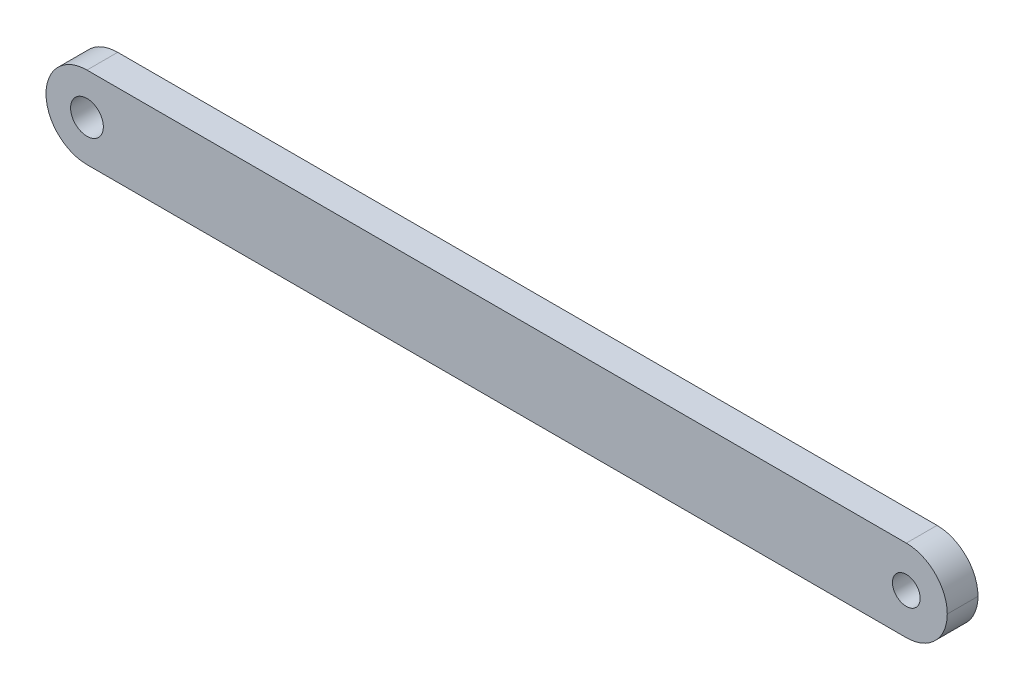
ISO-10303-21;
HEADER;
FILE_DESCRIPTION(('STEP AP214'),'2;1');
FILE_NAME('part.step','',(''),(''),'','','');
FILE_SCHEMA(('AUTOMOTIVE_DESIGN { 1 0 10303 214 1 1 1 1 }'));
ENDSEC;
DATA;
#1=APPLICATION_CONTEXT('core data for automotive mechanical design processes');
#2=APPLICATION_PROTOCOL_DEFINITION('international standard','automotive_design',2000,#1);
#3=PRODUCT_CONTEXT('',#1,'mechanical');
#4=PRODUCT('Part','Part','',(#3));
#5=PRODUCT_RELATED_PRODUCT_CATEGORY('part','',(#4));
#6=PRODUCT_DEFINITION_FORMATION('','',#4);
#7=PRODUCT_DEFINITION_CONTEXT('part definition',#1,'design');
#8=PRODUCT_DEFINITION('design','',#6,#7);
#9=PRODUCT_DEFINITION_SHAPE('','',#8);
#10=(LENGTH_UNIT() NAMED_UNIT(*) SI_UNIT(.MILLI.,.METRE.));
#11=(NAMED_UNIT(*) PLANE_ANGLE_UNIT() SI_UNIT($,.RADIAN.));
#12=(NAMED_UNIT(*) SI_UNIT($,.STERADIAN.) SOLID_ANGLE_UNIT());
#13=UNCERTAINTY_MEASURE_WITH_UNIT(LENGTH_MEASURE(1.E-05),#10,'distance_accuracy_value','');
#14=(GEOMETRIC_REPRESENTATION_CONTEXT(3) GLOBAL_UNCERTAINTY_ASSIGNED_CONTEXT((#13)) GLOBAL_UNIT_ASSIGNED_CONTEXT((#10,
#11,#12)) REPRESENTATION_CONTEXT('',''));
#15=CARTESIAN_POINT('',(0.,0.,0.));
#16=DIRECTION('',(0.,0.,1.));
#17=DIRECTION('',(1.,0.,0.));
#18=AXIS2_PLACEMENT_3D('',#15,#16,#17);
#19=CARTESIAN_POINT('',(55.8602220991314,3.999,3.));
#20=DIRECTION('',(0.,0.,-1.));
#21=DIRECTION('',(-1.,0.,0.));
#22=AXIS2_PLACEMENT_3D('',#19,#20,#21);
#23=CYLINDRICAL_SURFACE('',#22,4.);
#24=CARTESIAN_POINT('',(55.8602220991314,3.999,0.));
#25=DIRECTION('',(0.,0.,-1.));
#26=DIRECTION('',(-1.,0.,0.));
#27=AXIS2_PLACEMENT_3D('',#24,#25,#26);
#28=CIRCLE('',#27,4.);
#29=CARTESIAN_POINT('',(55.8602220991314,7.999,0.));
#30=VERTEX_POINT('',#29);
#31=CARTESIAN_POINT('',(59.8602219741314,3.99999999998902,0.));
#32=VERTEX_POINT('',#31);
#33=EDGE_CURVE('E130',#30,#32,#28,.T.);
#34=ORIENTED_EDGE('',*,*,#33,.F.);
#35=DIRECTION('',(0.,0.,-1.));
#36=VECTOR('',#35,1.);
#37=CARTESIAN_POINT('',(55.8602220991314,7.999,3.));
#38=LINE('',#37,#36);
#39=CARTESIAN_POINT('',(55.8602220991314,7.999,3.));
#40=VERTEX_POINT('',#39);
#41=EDGE_CURVE('E11',#40,#30,#38,.T.);
#42=ORIENTED_EDGE('',*,*,#41,.F.);
#43=CARTESIAN_POINT('',(55.8602220991314,3.999,3.));
#44=DIRECTION('',(0.,0.,-1.));
#45=DIRECTION('',(-1.,0.,0.));
#46=AXIS2_PLACEMENT_3D('',#43,#44,#45);
#47=CIRCLE('',#46,4.);
#48=CARTESIAN_POINT('',(59.8602219741314,3.99999999998902,3.));
#49=VERTEX_POINT('',#48);
#50=EDGE_CURVE('E151',#40,#49,#47,.T.);
#51=ORIENTED_EDGE('',*,*,#50,.T.);
#52=DIRECTION('',(0.,0.,-1.));
#53=VECTOR('',#52,1.);
#54=CARTESIAN_POINT('',(59.8602219741314,3.99999999998902,3.));
#55=LINE('',#54,#53);
#56=EDGE_CURVE('E42',#49,#32,#55,.T.);
#57=ORIENTED_EDGE('',*,*,#56,.T.);
#58=EDGE_LOOP('',(#34,#42,#51,#57));
#59=FACE_BOUND('',#58,.T.);
#60=ADVANCED_FACE('F39',(#59),#23,.T.);
#61=CARTESIAN_POINT('',(-24.1383205351164,7.999,3.));
#62=DIRECTION('',(0.,1.,0.));
#63=DIRECTION('',(0.,0.,1.));
#64=AXIS2_PLACEMENT_3D('',#61,#62,#63);
#65=PLANE('',#64);
#66=DIRECTION('',(1.,0.,0.));
#67=VECTOR('',#66,1.);
#68=CARTESIAN_POINT('',(-24.1383205351164,7.999,0.));
#69=LINE('',#68,#67);
#70=CARTESIAN_POINT('',(-24.1383205351164,7.999,0.));
#71=VERTEX_POINT('',#70);
#72=EDGE_CURVE('E148',#71,#30,#69,.T.);
#73=ORIENTED_EDGE('',*,*,#72,.F.);
#74=DIRECTION('',(0.,0.,-1.));
#75=VECTOR('',#74,1.);
#76=CARTESIAN_POINT('',(-24.1383205351164,7.999,3.));
#77=LINE('',#76,#75);
#78=CARTESIAN_POINT('',(-24.1383205351164,7.999,3.));
#79=VERTEX_POINT('',#78);
#80=EDGE_CURVE('E49',#79,#71,#77,.T.);
#81=ORIENTED_EDGE('',*,*,#80,.F.);
#82=DIRECTION('',(1.,0.,0.));
#83=VECTOR('',#82,1.);
#84=CARTESIAN_POINT('',(-24.1383205351164,7.999,3.));
#85=LINE('',#84,#83);
#86=EDGE_CURVE('E116',#79,#40,#85,.T.);
#87=ORIENTED_EDGE('',*,*,#86,.T.);
#88=ORIENTED_EDGE('',*,*,#41,.T.);
#89=EDGE_LOOP('',(#73,#81,#87,#88));
#90=FACE_BOUND('',#89,.T.);
#91=ADVANCED_FACE('F163',(#90),#65,.T.);
#92=CARTESIAN_POINT('',(-24.1383205351164,3.999,3.));
#93=DIRECTION('',(0.,0.,-1.));
#94=DIRECTION('',(-1.,0.,0.));
#95=AXIS2_PLACEMENT_3D('',#92,#93,#94);
#96=CYLINDRICAL_SURFACE('',#95,4.);
#97=CARTESIAN_POINT('',(-24.1383205351164,3.999,0.));
#98=DIRECTION('',(0.,0.,-1.));
#99=DIRECTION('',(-1.,0.,0.));
#100=AXIS2_PLACEMENT_3D('',#97,#98,#99);
#101=CIRCLE('',#100,4.);
#102=CARTESIAN_POINT('',(-28.1383205351164,3.99900000000404,0.));
#103=VERTEX_POINT('',#102);
#104=EDGE_CURVE('E102',#103,#71,#101,.T.);
#105=ORIENTED_EDGE('',*,*,#104,.F.);
#106=DIRECTION('',(0.,0.,-1.));
#107=VECTOR('',#106,1.);
#108=CARTESIAN_POINT('',(-28.1383205351164,3.99900000000404,3.));
#109=LINE('',#108,#107);
#110=CARTESIAN_POINT('',(-28.1383205351164,3.99900000000404,3.));
#111=VERTEX_POINT('',#110);
#112=EDGE_CURVE('E97',#111,#103,#109,.T.);
#113=ORIENTED_EDGE('',*,*,#112,.F.);
#114=CARTESIAN_POINT('',(-24.1383205351164,3.999,3.));
#115=DIRECTION('',(0.,0.,-1.));
#116=DIRECTION('',(-1.,0.,0.));
#117=AXIS2_PLACEMENT_3D('',#114,#115,#116);
#118=CIRCLE('',#117,4.);
#119=EDGE_CURVE('E100',#111,#79,#118,.T.);
#120=ORIENTED_EDGE('',*,*,#119,.T.);
#121=ORIENTED_EDGE('',*,*,#80,.T.);
#122=EDGE_LOOP('',(#105,#113,#120,#121));
#123=FACE_BOUND('',#122,.T.);
#124=ADVANCED_FACE('F99',(#123),#96,.T.);
#125=CARTESIAN_POINT('',(-24.1383206601164,4.,3.));
#126=DIRECTION('',(0.,0.,-1.));
#127=DIRECTION('',(-1.,0.,0.));
#128=AXIS2_PLACEMENT_3D('',#125,#126,#127);
#129=CYLINDRICAL_SURFACE('',#128,4.);
#130=CARTESIAN_POINT('',(-24.1383206601164,4.,0.));
#131=DIRECTION('',(0.,0.,-1.));
#132=DIRECTION('',(-1.,0.,0.));
#133=AXIS2_PLACEMENT_3D('',#130,#131,#132);
#134=CIRCLE('',#133,4.);
#135=CARTESIAN_POINT('',(-24.1383206601164,0.,0.));
#136=VERTEX_POINT('',#135);
#137=EDGE_CURVE('E143',#136,#103,#134,.T.);
#138=ORIENTED_EDGE('',*,*,#137,.F.);
#139=DIRECTION('',(0.,0.,-1.));
#140=VECTOR('',#139,1.);
#141=CARTESIAN_POINT('',(-24.1383206601164,0.,3.));
#142=LINE('',#141,#140);
#143=CARTESIAN_POINT('',(-24.1383206601164,0.,3.));
#144=VERTEX_POINT('',#143);
#145=EDGE_CURVE('E108',#144,#136,#142,.T.);
#146=ORIENTED_EDGE('',*,*,#145,.F.);
#147=CARTESIAN_POINT('',(-24.1383206601164,4.,3.));
#148=DIRECTION('',(0.,0.,-1.));
#149=DIRECTION('',(-1.,0.,0.));
#150=AXIS2_PLACEMENT_3D('',#147,#148,#149);
#151=CIRCLE('',#150,4.);
#152=EDGE_CURVE('E114',#144,#111,#151,.T.);
#153=ORIENTED_EDGE('',*,*,#152,.T.);
#154=ORIENTED_EDGE('',*,*,#112,.T.);
#155=EDGE_LOOP('',(#138,#146,#153,#154));
#156=FACE_BOUND('',#155,.T.);
#157=ADVANCED_FACE('F119',(#156),#129,.T.);
#158=CARTESIAN_POINT('',(55.8602219741314,0.,3.));
#159=DIRECTION('',(0.,-1.,0.));
#160=DIRECTION('',(0.,0.,-1.));
#161=AXIS2_PLACEMENT_3D('',#158,#159,#160);
#162=PLANE('',#161);
#163=DIRECTION('',(-1.,0.,0.));
#164=VECTOR('',#163,1.);
#165=CARTESIAN_POINT('',(55.8602219741314,0.,0.));
#166=LINE('',#165,#164);
#167=CARTESIAN_POINT('',(55.8602219741314,0.,0.));
#168=VERTEX_POINT('',#167);
#169=EDGE_CURVE('E139',#168,#136,#166,.T.);
#170=ORIENTED_EDGE('',*,*,#169,.F.);
#171=DIRECTION('',(0.,0.,-1.));
#172=VECTOR('',#171,1.);
#173=CARTESIAN_POINT('',(55.8602219741314,0.,3.));
#174=LINE('',#173,#172);
#175=CARTESIAN_POINT('',(55.8602219741314,0.,3.));
#176=VERTEX_POINT('',#175);
#177=EDGE_CURVE('E156',#176,#168,#174,.T.);
#178=ORIENTED_EDGE('',*,*,#177,.F.);
#179=DIRECTION('',(-1.,0.,0.));
#180=VECTOR('',#179,1.);
#181=CARTESIAN_POINT('',(55.8602219741314,0.,3.));
#182=LINE('',#181,#180);
#183=EDGE_CURVE('E121',#176,#144,#182,.T.);
#184=ORIENTED_EDGE('',*,*,#183,.T.);
#185=ORIENTED_EDGE('',*,*,#145,.T.);
#186=EDGE_LOOP('',(#170,#178,#184,#185));
#187=FACE_BOUND('',#186,.T.);
#188=ADVANCED_FACE('F176',(#187),#162,.T.);
#189=CARTESIAN_POINT('',(55.8602219741314,4.,3.));
#190=DIRECTION('',(0.,0.,-1.));
#191=DIRECTION('',(-1.,0.,0.));
#192=AXIS2_PLACEMENT_3D('',#189,#190,#191);
#193=CYLINDRICAL_SURFACE('',#192,4.);
#194=CARTESIAN_POINT('',(55.8602219741314,4.,0.));
#195=DIRECTION('',(0.,0.,-1.));
#196=DIRECTION('',(-1.,0.,0.));
#197=AXIS2_PLACEMENT_3D('',#194,#195,#196);
#198=CIRCLE('',#197,4.);
#199=EDGE_CURVE('E134',#32,#168,#198,.T.);
#200=ORIENTED_EDGE('',*,*,#199,.F.);
#201=ORIENTED_EDGE('',*,*,#56,.F.);
#202=CARTESIAN_POINT('',(55.8602219741314,4.,3.));
#203=DIRECTION('',(0.,0.,-1.));
#204=DIRECTION('',(-1.,0.,0.));
#205=AXIS2_PLACEMENT_3D('',#202,#203,#204);
#206=CIRCLE('',#205,4.);
#207=EDGE_CURVE('E124',#49,#176,#206,.T.);
#208=ORIENTED_EDGE('',*,*,#207,.T.);
#209=ORIENTED_EDGE('',*,*,#177,.T.);
#210=EDGE_LOOP('',(#200,#201,#208,#209));
#211=FACE_BOUND('',#210,.T.);
#212=ADVANCED_FACE('F160',(#211),#193,.T.);
#213=CARTESIAN_POINT('',(55.8602220991314,3.999,3.));
#214=DIRECTION('',(0.,0.,-1.));
#215=DIRECTION('',(-1.,0.,0.));
#216=AXIS2_PLACEMENT_3D('',#213,#214,#215);
#217=PLANE('',#216);
#218=CARTESIAN_POINT('',(-24.138809000818,3.99851153429842,3.));
#219=DIRECTION('',(0.,0.,1.));
#220=DIRECTION('',(1.,0.,0.));
#221=AXIS2_PLACEMENT_3D('',#218,#219,#220);
#222=CIRCLE('',#221,1.6);
#223=CARTESIAN_POINT('',(-22.538809000818,3.99851153429842,3.));
#224=VERTEX_POINT('',#223);
#225=EDGE_CURVE('E205',#224,#224,#222,.T.);
#226=ORIENTED_EDGE('',*,*,#225,.F.);
#227=EDGE_LOOP('',(#226));
#228=FACE_BOUND('',#227,.T.);
#229=CARTESIAN_POINT('',(55.8597335084298,3.99951153429841,3.));
#230=DIRECTION('',(0.,0.,-1.));
#231=DIRECTION('',(1.,0.,0.));
#232=AXIS2_PLACEMENT_3D('',#229,#230,#231);
#233=CIRCLE('',#232,1.35401050244143);
#234=CARTESIAN_POINT('',(54.5057230059884,3.99951153429841,3.));
#235=VERTEX_POINT('',#234);
#236=EDGE_CURVE('E135',#235,#235,#233,.T.);
#237=ORIENTED_EDGE('',*,*,#236,.T.);
#238=EDGE_LOOP('',(#237));
#239=FACE_BOUND('',#238,.T.);
#240=ORIENTED_EDGE('',*,*,#50,.F.);
#241=ORIENTED_EDGE('',*,*,#86,.F.);
#242=ORIENTED_EDGE('',*,*,#119,.F.);
#243=ORIENTED_EDGE('',*,*,#152,.F.);
#244=ORIENTED_EDGE('',*,*,#183,.F.);
#245=ORIENTED_EDGE('',*,*,#207,.F.);
#246=EDGE_LOOP('',(#240,#241,#242,#243,#244,#245));
#247=FACE_BOUND('',#246,.T.);
#248=ADVANCED_FACE('F112',(#228,#239,#247),#217,.F.);
#249=CARTESIAN_POINT('',(55.8602220991314,3.999,0.));
#250=DIRECTION('',(0.,0.,-1.));
#251=DIRECTION('',(-1.,0.,0.));
#252=AXIS2_PLACEMENT_3D('',#249,#250,#251);
#253=PLANE('',#252);
#254=CARTESIAN_POINT('',(-24.138809000818,3.99851153429842,0.));
#255=DIRECTION('',(0.,0.,1.));
#256=DIRECTION('',(1.,0.,0.));
#257=AXIS2_PLACEMENT_3D('',#254,#255,#256);
#258=CIRCLE('',#257,1.6);
#259=CARTESIAN_POINT('',(-22.538809000818,3.99851153429842,0.));
#260=VERTEX_POINT('',#259);
#261=EDGE_CURVE('E203',#260,#260,#258,.T.);
#262=ORIENTED_EDGE('',*,*,#261,.T.);
#263=EDGE_LOOP('',(#262));
#264=FACE_BOUND('',#263,.T.);
#265=CARTESIAN_POINT('',(55.8597335084298,3.99951153429841,0.));
#266=DIRECTION('',(0.,0.,-1.));
#267=DIRECTION('',(1.,0.,0.));
#268=AXIS2_PLACEMENT_3D('',#265,#266,#267);
#269=CIRCLE('',#268,1.35401050244143);
#270=CARTESIAN_POINT('',(54.5057230059884,3.99951153429841,0.));
#271=VERTEX_POINT('',#270);
#272=EDGE_CURVE('E209',#271,#271,#269,.T.);
#273=ORIENTED_EDGE('',*,*,#272,.F.);
#274=EDGE_LOOP('',(#273));
#275=FACE_BOUND('',#274,.T.);
#276=ORIENTED_EDGE('',*,*,#33,.T.);
#277=ORIENTED_EDGE('',*,*,#199,.T.);
#278=ORIENTED_EDGE('',*,*,#169,.T.);
#279=ORIENTED_EDGE('',*,*,#137,.T.);
#280=ORIENTED_EDGE('',*,*,#104,.T.);
#281=ORIENTED_EDGE('',*,*,#72,.T.);
#282=EDGE_LOOP('',(#276,#277,#278,#279,#280,#281));
#283=FACE_BOUND('',#282,.T.);
#284=ADVANCED_FACE('F162',(#264,#275,#283),#253,.T.);
#285=CARTESIAN_POINT('',(55.8597335084298,3.99951153429841,3.));
#286=DIRECTION('',(0.,0.,-1.));
#287=DIRECTION('',(-1.,0.,0.));
#288=AXIS2_PLACEMENT_3D('',#285,#286,#287);
#289=CYLINDRICAL_SURFACE('',#288,1.35401050244143);
#290=CARTESIAN_POINT('',(54.5057230059884,3.99951153429841,3.));
#291=CARTESIAN_POINT('',(54.5057230059884,3.99951153429841,2.96875));
#292=CARTESIAN_POINT('',(54.5057230059884,3.99951153429841,2.9375));
#293=CARTESIAN_POINT('',(54.5057230059884,3.99951153429841,2.875));
#294=CARTESIAN_POINT('',(54.5057230059884,3.99951153429841,2.84375));
#295=CARTESIAN_POINT('',(54.5057230059884,3.99951153429841,2.78125));
#296=CARTESIAN_POINT('',(54.5057230059884,3.99951153429841,2.75));
#297=CARTESIAN_POINT('',(54.5057230059884,3.99951153429841,2.6875));
#298=CARTESIAN_POINT('',(54.5057230059884,3.99951153429841,2.65625));
#299=CARTESIAN_POINT('',(54.5057230059884,3.99951153429841,2.59375));
#300=CARTESIAN_POINT('',(54.5057230059884,3.99951153429841,2.5625));
#301=CARTESIAN_POINT('',(54.5057230059884,3.99951153429841,2.5));
#302=CARTESIAN_POINT('',(54.5057230059884,3.99951153429841,2.46875));
#303=CARTESIAN_POINT('',(54.5057230059884,3.99951153429841,2.40625));
#304=CARTESIAN_POINT('',(54.5057230059884,3.99951153429841,2.375));
#305=CARTESIAN_POINT('',(54.5057230059884,3.99951153429841,2.3125));
#306=CARTESIAN_POINT('',(54.5057230059884,3.99951153429841,2.28125));
#307=CARTESIAN_POINT('',(54.5057230059884,3.99951153429841,2.21875));
#308=CARTESIAN_POINT('',(54.5057230059884,3.99951153429841,2.1875));
#309=CARTESIAN_POINT('',(54.5057230059884,3.99951153429841,2.125));
#310=CARTESIAN_POINT('',(54.5057230059884,3.99951153429841,2.09375));
#311=CARTESIAN_POINT('',(54.5057230059884,3.99951153429841,2.03125));
#312=CARTESIAN_POINT('',(54.5057230059884,3.99951153429841,2.));
#313=CARTESIAN_POINT('',(54.5057230059884,3.99951153429841,1.9375));
#314=CARTESIAN_POINT('',(54.5057230059884,3.99951153429841,1.90625));
#315=CARTESIAN_POINT('',(54.5057230059884,3.99951153429841,1.84375));
#316=CARTESIAN_POINT('',(54.5057230059884,3.99951153429841,1.8125));
#317=CARTESIAN_POINT('',(54.5057230059884,3.99951153429841,1.75));
#318=CARTESIAN_POINT('',(54.5057230059884,3.99951153429841,1.71875));
#319=CARTESIAN_POINT('',(54.5057230059884,3.99951153429841,1.65625));
#320=CARTESIAN_POINT('',(54.5057230059884,3.99951153429841,1.625));
#321=CARTESIAN_POINT('',(54.5057230059884,3.99951153429841,1.5625));
#322=CARTESIAN_POINT('',(54.5057230059884,3.99951153429841,1.53125));
#323=CARTESIAN_POINT('',(54.5057230059884,3.99951153429841,1.46875));
#324=CARTESIAN_POINT('',(54.5057230059884,3.99951153429841,1.4375));
#325=CARTESIAN_POINT('',(54.5057230059884,3.99951153429841,1.375));
#326=CARTESIAN_POINT('',(54.5057230059884,3.99951153429841,1.34375));
#327=CARTESIAN_POINT('',(54.5057230059884,3.99951153429841,1.28125));
#328=CARTESIAN_POINT('',(54.5057230059884,3.99951153429841,1.25));
#329=CARTESIAN_POINT('',(54.5057230059884,3.99951153429841,1.1875));
#330=CARTESIAN_POINT('',(54.5057230059884,3.99951153429841,1.15625));
#331=CARTESIAN_POINT('',(54.5057230059884,3.99951153429841,1.09375));
#332=CARTESIAN_POINT('',(54.5057230059884,3.99951153429841,1.0625));
#333=CARTESIAN_POINT('',(54.5057230059884,3.99951153429841,1.));
#334=CARTESIAN_POINT('',(54.5057230059884,3.99951153429841,0.96875));
#335=CARTESIAN_POINT('',(54.5057230059884,3.99951153429841,0.90625));
#336=CARTESIAN_POINT('',(54.5057230059884,3.99951153429841,0.875));
#337=CARTESIAN_POINT('',(54.5057230059884,3.99951153429841,0.8125));
#338=CARTESIAN_POINT('',(54.5057230059884,3.99951153429841,0.78125));
#339=CARTESIAN_POINT('',(54.5057230059884,3.99951153429841,0.71875));
#340=CARTESIAN_POINT('',(54.5057230059884,3.99951153429841,0.6875));
#341=CARTESIAN_POINT('',(54.5057230059884,3.99951153429841,0.625));
#342=CARTESIAN_POINT('',(54.5057230059884,3.99951153429841,0.59375));
#343=CARTESIAN_POINT('',(54.5057230059884,3.99951153429841,0.53125));
#344=CARTESIAN_POINT('',(54.5057230059884,3.99951153429841,0.5));
#345=CARTESIAN_POINT('',(54.5057230059884,3.99951153429841,0.4375));
#346=CARTESIAN_POINT('',(54.5057230059884,3.99951153429841,0.40625));
#347=CARTESIAN_POINT('',(54.5057230059884,3.99951153429841,0.34375));
#348=CARTESIAN_POINT('',(54.5057230059884,3.99951153429841,0.3125));
#349=CARTESIAN_POINT('',(54.5057230059884,3.99951153429841,0.25));
#350=CARTESIAN_POINT('',(54.5057230059884,3.99951153429841,0.21875));
#351=CARTESIAN_POINT('',(54.5057230059884,3.99951153429841,0.15625));
#352=CARTESIAN_POINT('',(54.5057230059884,3.99951153429841,0.125));
#353=CARTESIAN_POINT('',(54.5057230059884,3.99951153429841,0.0625000000000001));
#354=CARTESIAN_POINT('',(54.5057230059884,3.99951153429841,0.03125));
#355=CARTESIAN_POINT('',(54.5057230059884,3.99951153429841,0.));
#356=B_SPLINE_CURVE_WITH_KNOTS('',3,(#290,#291,#292,#293,#294,#295,#296,#297,#298,#299,#300,
#301,#302,#303,#304,#305,#306,#307,#308,#309,#310,#311,#312,#313,#314,#315,#316,#317,#318,#319,
#320,#321,#322,#323,#324,#325,#326,#327,#328,#329,#330,#331,#332,#333,#334,#335,#336,#337,#338,
#339,#340,#341,#342,#343,#344,#345,#346,#347,#348,#349,#350,#351,#352,#353,#354,#355),
.UNSPECIFIED.,.F.,.F.,(4,2,2,2,2,2,2,2,2,2,2,2,2,2,2,2,2,2,2,2,2,2,2,2,2,2,2,2,2,2,2,2,4),(0.,
0.0937500000000001,0.1875,0.28125,0.375,0.46875,0.5625,0.656250000000001,0.750000000000001,
0.843750000000001,0.9375,1.03125,1.125,1.21875,1.3125,1.40625,1.5,1.59375,1.6875,1.78125,1.875,
1.96875,2.0625,2.15625,2.25,2.34375,2.4375,2.53125,2.625,2.71875,2.8125,2.90625,3.),.UNSPECIFIED.);
#357=EDGE_CURVE('BSEAM187',#235,#271,#356,.T.);
#358=ORIENTED_EDGE('',*,*,#236,.F.);
#359=ORIENTED_EDGE('',*,*,#272,.T.);
#360=ORIENTED_EDGE('',*,*,#357,.T.);
#361=ORIENTED_EDGE('',*,*,#357,.F.);
#362=EDGE_LOOP('',(#358,#360,#359,#361));
#363=FACE_BOUND('',#362,.T.);
#364=ADVANCED_FACE('F187',(#363),#289,.F.);
#365=CARTESIAN_POINT('',(-24.138809000818,3.99851153429842,0.));
#366=DIRECTION('',(0.,0.,1.));
#367=DIRECTION('',(1.,0.,0.));
#368=AXIS2_PLACEMENT_3D('',#365,#366,#367);
#369=CYLINDRICAL_SURFACE('',#368,1.6);
#370=CARTESIAN_POINT('',(-22.538809000818,3.99851153429842,0.));
#371=CARTESIAN_POINT('',(-22.538809000818,3.99851153429842,0.03125));
#372=CARTESIAN_POINT('',(-22.538809000818,3.99851153429842,0.0625));
#373=CARTESIAN_POINT('',(-22.538809000818,3.99851153429842,0.125));
#374=CARTESIAN_POINT('',(-22.538809000818,3.99851153429842,0.15625));
#375=CARTESIAN_POINT('',(-22.538809000818,3.99851153429842,0.21875));
#376=CARTESIAN_POINT('',(-22.538809000818,3.99851153429842,0.25));
#377=CARTESIAN_POINT('',(-22.538809000818,3.99851153429842,0.3125));
#378=CARTESIAN_POINT('',(-22.538809000818,3.99851153429842,0.34375));
#379=CARTESIAN_POINT('',(-22.538809000818,3.99851153429842,0.40625));
#380=CARTESIAN_POINT('',(-22.538809000818,3.99851153429842,0.4375));
#381=CARTESIAN_POINT('',(-22.538809000818,3.99851153429842,0.5));
#382=CARTESIAN_POINT('',(-22.538809000818,3.99851153429842,0.53125));
#383=CARTESIAN_POINT('',(-22.538809000818,3.99851153429842,0.59375));
#384=CARTESIAN_POINT('',(-22.538809000818,3.99851153429842,0.625));
#385=CARTESIAN_POINT('',(-22.538809000818,3.99851153429842,0.6875));
#386=CARTESIAN_POINT('',(-22.538809000818,3.99851153429842,0.71875));
#387=CARTESIAN_POINT('',(-22.538809000818,3.99851153429842,0.78125));
#388=CARTESIAN_POINT('',(-22.538809000818,3.99851153429842,0.8125));
#389=CARTESIAN_POINT('',(-22.538809000818,3.99851153429842,0.875));
#390=CARTESIAN_POINT('',(-22.538809000818,3.99851153429842,0.90625));
#391=CARTESIAN_POINT('',(-22.538809000818,3.99851153429842,0.96875));
#392=CARTESIAN_POINT('',(-22.538809000818,3.99851153429842,1.));
#393=CARTESIAN_POINT('',(-22.538809000818,3.99851153429842,1.0625));
#394=CARTESIAN_POINT('',(-22.538809000818,3.99851153429842,1.09375));
#395=CARTESIAN_POINT('',(-22.538809000818,3.99851153429842,1.15625));
#396=CARTESIAN_POINT('',(-22.538809000818,3.99851153429842,1.1875));
#397=CARTESIAN_POINT('',(-22.538809000818,3.99851153429842,1.25));
#398=CARTESIAN_POINT('',(-22.538809000818,3.99851153429842,1.28125));
#399=CARTESIAN_POINT('',(-22.538809000818,3.99851153429842,1.34375));
#400=CARTESIAN_POINT('',(-22.538809000818,3.99851153429842,1.375));
#401=CARTESIAN_POINT('',(-22.538809000818,3.99851153429842,1.4375));
#402=CARTESIAN_POINT('',(-22.538809000818,3.99851153429842,1.46875));
#403=CARTESIAN_POINT('',(-22.538809000818,3.99851153429842,1.53125));
#404=CARTESIAN_POINT('',(-22.538809000818,3.99851153429842,1.5625));
#405=CARTESIAN_POINT('',(-22.538809000818,3.99851153429842,1.625));
#406=CARTESIAN_POINT('',(-22.538809000818,3.99851153429842,1.65625));
#407=CARTESIAN_POINT('',(-22.538809000818,3.99851153429842,1.71875));
#408=CARTESIAN_POINT('',(-22.538809000818,3.99851153429842,1.75));
#409=CARTESIAN_POINT('',(-22.538809000818,3.99851153429842,1.8125));
#410=CARTESIAN_POINT('',(-22.538809000818,3.99851153429842,1.84375));
#411=CARTESIAN_POINT('',(-22.538809000818,3.99851153429842,1.90625));
#412=CARTESIAN_POINT('',(-22.538809000818,3.99851153429842,1.9375));
#413=CARTESIAN_POINT('',(-22.538809000818,3.99851153429842,2.));
#414=CARTESIAN_POINT('',(-22.538809000818,3.99851153429842,2.03125));
#415=CARTESIAN_POINT('',(-22.538809000818,3.99851153429842,2.09375));
#416=CARTESIAN_POINT('',(-22.538809000818,3.99851153429842,2.125));
#417=CARTESIAN_POINT('',(-22.538809000818,3.99851153429842,2.1875));
#418=CARTESIAN_POINT('',(-22.538809000818,3.99851153429842,2.21875));
#419=CARTESIAN_POINT('',(-22.538809000818,3.99851153429842,2.28125));
#420=CARTESIAN_POINT('',(-22.538809000818,3.99851153429842,2.3125));
#421=CARTESIAN_POINT('',(-22.538809000818,3.99851153429842,2.375));
#422=CARTESIAN_POINT('',(-22.538809000818,3.99851153429842,2.40625));
#423=CARTESIAN_POINT('',(-22.538809000818,3.99851153429842,2.46875));
#424=CARTESIAN_POINT('',(-22.538809000818,3.99851153429842,2.5));
#425=CARTESIAN_POINT('',(-22.538809000818,3.99851153429842,2.5625));
#426=CARTESIAN_POINT('',(-22.538809000818,3.99851153429842,2.59375));
#427=CARTESIAN_POINT('',(-22.538809000818,3.99851153429842,2.65625));
#428=CARTESIAN_POINT('',(-22.538809000818,3.99851153429842,2.6875));
#429=CARTESIAN_POINT('',(-22.538809000818,3.99851153429842,2.75));
#430=CARTESIAN_POINT('',(-22.538809000818,3.99851153429842,2.78125));
#431=CARTESIAN_POINT('',(-22.538809000818,3.99851153429842,2.84375));
#432=CARTESIAN_POINT('',(-22.538809000818,3.99851153429842,2.875));
#433=CARTESIAN_POINT('',(-22.538809000818,3.99851153429842,2.9375));
#434=CARTESIAN_POINT('',(-22.538809000818,3.99851153429842,2.96875));
#435=CARTESIAN_POINT('',(-22.538809000818,3.99851153429842,3.));
#436=B_SPLINE_CURVE_WITH_KNOTS('',3,(#370,#371,#372,#373,#374,#375,#376,#377,#378,#379,#380,
#381,#382,#383,#384,#385,#386,#387,#388,#389,#390,#391,#392,#393,#394,#395,#396,#397,#398,#399,
#400,#401,#402,#403,#404,#405,#406,#407,#408,#409,#410,#411,#412,#413,#414,#415,#416,#417,#418,
#419,#420,#421,#422,#423,#424,#425,#426,#427,#428,#429,#430,#431,#432,#433,#434,#435),
.UNSPECIFIED.,.F.,.F.,(4,2,2,2,2,2,2,2,2,2,2,2,2,2,2,2,2,2,2,2,2,2,2,2,2,2,2,2,2,2,2,2,4),(0.,
0.09375,0.1875,0.28125,0.375,0.46875,0.5625,0.65625,0.75,0.84375,0.9375,1.03125,1.125,1.21875,
1.3125,1.40625,1.5,1.59375,1.6875,1.78125,1.875,1.96875,2.0625,2.15625,2.25,2.34375,2.4375,
2.53125,2.625,2.71875,2.8125,2.90625,3.),.UNSPECIFIED.);
#437=EDGE_CURVE('BSEAM194',#260,#224,#436,.T.);
#438=ORIENTED_EDGE('',*,*,#261,.F.);
#439=ORIENTED_EDGE('',*,*,#225,.T.);
#440=ORIENTED_EDGE('',*,*,#437,.T.);
#441=ORIENTED_EDGE('',*,*,#437,.F.);
#442=EDGE_LOOP('',(#438,#440,#439,#441));
#443=FACE_BOUND('',#442,.T.);
#444=ADVANCED_FACE('F194',(#443),#369,.F.);
#445=CLOSED_SHELL('',(#60,#91,#124,#157,#188,#212,#248,#284,#364,#444));
#446=MANIFOLD_SOLID_BREP('B2',#445);
#447=ADVANCED_BREP_SHAPE_REPRESENTATION('',(#18,#446),#14);
#448=SHAPE_DEFINITION_REPRESENTATION(#9,#447);
ENDSEC;
END-ISO-10303-21;
